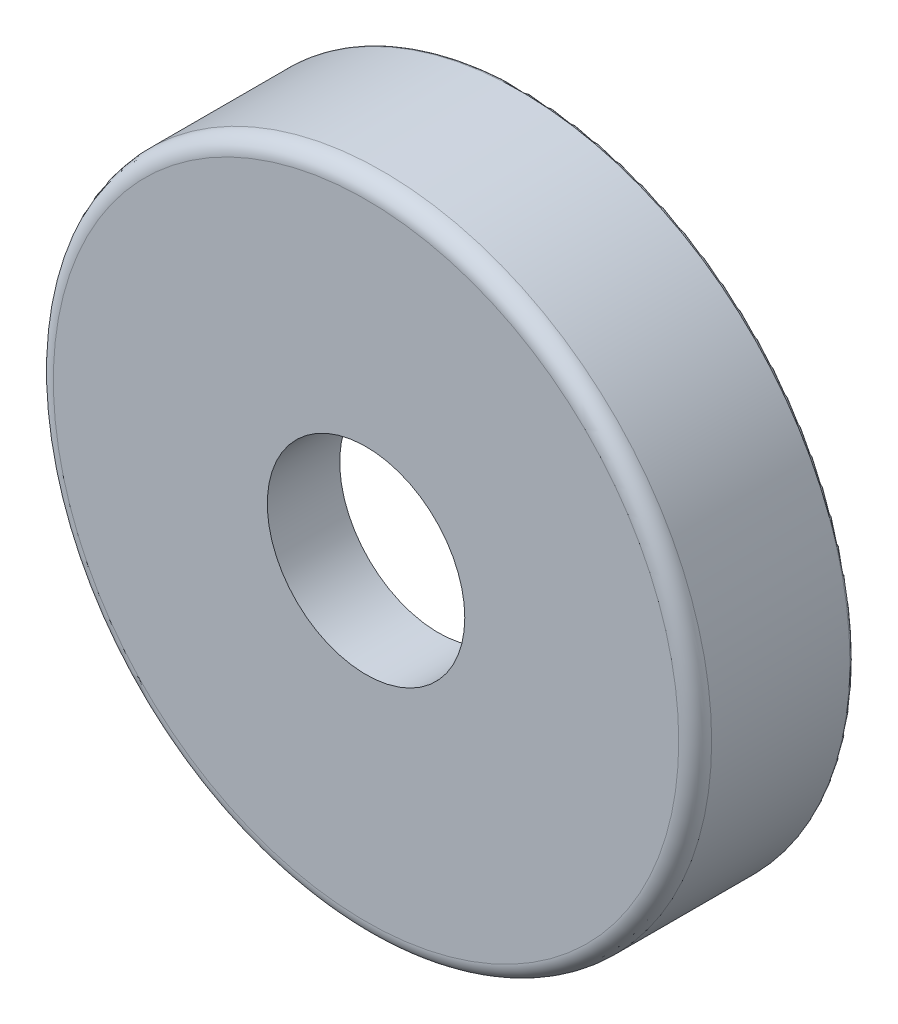
ISO-10303-21;
HEADER;
FILE_DESCRIPTION(('STEP AP214'),'2;1');
FILE_NAME('part.step','',(''),(''),'','','');
FILE_SCHEMA(('AUTOMOTIVE_DESIGN { 1 0 10303 214 1 1 1 1 }'));
ENDSEC;
DATA;
#1=APPLICATION_CONTEXT('core data for automotive mechanical design processes');
#2=APPLICATION_PROTOCOL_DEFINITION('international standard','automotive_design',2000,#1);
#3=PRODUCT_CONTEXT('',#1,'mechanical');
#4=PRODUCT('Part','Part','',(#3));
#5=PRODUCT_RELATED_PRODUCT_CATEGORY('part','',(#4));
#6=PRODUCT_DEFINITION_FORMATION('','',#4);
#7=PRODUCT_DEFINITION_CONTEXT('part definition',#1,'design');
#8=PRODUCT_DEFINITION('design','',#6,#7);
#9=PRODUCT_DEFINITION_SHAPE('','',#8);
#10=(LENGTH_UNIT() NAMED_UNIT(*) SI_UNIT(.MILLI.,.METRE.));
#11=(NAMED_UNIT(*) PLANE_ANGLE_UNIT() SI_UNIT($,.RADIAN.));
#12=(NAMED_UNIT(*) SI_UNIT($,.STERADIAN.) SOLID_ANGLE_UNIT());
#13=UNCERTAINTY_MEASURE_WITH_UNIT(LENGTH_MEASURE(1.E-05),#10,'distance_accuracy_value','');
#14=(GEOMETRIC_REPRESENTATION_CONTEXT(3) GLOBAL_UNCERTAINTY_ASSIGNED_CONTEXT((#13)) GLOBAL_UNIT_ASSIGNED_CONTEXT((#10,
#11,#12)) REPRESENTATION_CONTEXT('',''));
#15=CARTESIAN_POINT('',(0.,0.,0.));
#16=DIRECTION('',(0.,0.,1.));
#17=DIRECTION('',(1.,0.,0.));
#18=AXIS2_PLACEMENT_3D('',#15,#16,#17);
#19=CARTESIAN_POINT('',(0.,0.,4.8));
#20=DIRECTION('',(0.,0.,-1.));
#21=DIRECTION('',(-1.,0.,0.));
#22=AXIS2_PLACEMENT_3D('',#19,#20,#21);
#23=CYLINDRICAL_SURFACE('',#22,3.);
#24=CARTESIAN_POINT('',(0.,0.,4.8));
#25=DIRECTION('',(0.,0.,1.));
#26=DIRECTION('',(1.,0.,0.));
#27=AXIS2_PLACEMENT_3D('',#24,#25,#26);
#28=CIRCLE('',#27,3.);
#29=CARTESIAN_POINT('',(3.,0.,4.8));
#30=VERTEX_POINT('',#29);
#31=EDGE_CURVE('E67',#30,#30,#28,.T.);
#32=ORIENTED_EDGE('',*,*,#31,.T.);
#33=EDGE_LOOP('',(#32));
#34=FACE_BOUND('',#33,.T.);
#35=CARTESIAN_POINT('',(0.,0.,2.6));
#36=DIRECTION('',(0.,0.,1.));
#37=DIRECTION('',(1.,0.,0.));
#38=AXIS2_PLACEMENT_3D('',#35,#36,#37);
#39=CIRCLE('',#38,3.);
#40=CARTESIAN_POINT('',(3.,0.,2.6));
#41=VERTEX_POINT('',#40);
#42=EDGE_CURVE('E95',#41,#41,#39,.T.);
#43=ORIENTED_EDGE('',*,*,#42,.F.);
#44=EDGE_LOOP('',(#43));
#45=FACE_BOUND('',#44,.T.);
#46=ADVANCED_FACE('F43',(#34,#45),#23,.F.);
#47=CARTESIAN_POINT('',(0.,0.,4.8));
#48=DIRECTION('',(0.,0.,1.));
#49=DIRECTION('',(1.,0.,0.));
#50=AXIS2_PLACEMENT_3D('',#47,#48,#49);
#51=PLANE('',#50);
#52=CARTESIAN_POINT('',(0.,0.,4.8));
#53=DIRECTION('',(0.,0.,1.));
#54=DIRECTION('',(1.,0.,0.));
#55=AXIS2_PLACEMENT_3D('',#52,#53,#54);
#56=CIRCLE('',#55,9.5);
#57=CARTESIAN_POINT('',(9.5,0.,4.8));
#58=VERTEX_POINT('',#57);
#59=EDGE_CURVE('E61',#58,#58,#56,.T.);
#60=ORIENTED_EDGE('',*,*,#59,.T.);
#61=EDGE_LOOP('',(#60));
#62=FACE_BOUND('',#61,.T.);
#63=ORIENTED_EDGE('',*,*,#31,.F.);
#64=EDGE_LOOP('',(#63));
#65=FACE_BOUND('',#64,.T.);
#66=ADVANCED_FACE('F104',(#62,#65),#51,.T.);
#67=CARTESIAN_POINT('',(0.,0.,0.));
#68=DIRECTION('',(0.,0.,1.));
#69=DIRECTION('',(1.,0.,0.));
#70=AXIS2_PLACEMENT_3D('',#67,#68,#69);
#71=PLANE('',#70);
#72=CARTESIAN_POINT('',(0.,0.,0.));
#73=DIRECTION('',(0.,0.,1.));
#74=DIRECTION('',(1.,0.,0.));
#75=AXIS2_PLACEMENT_3D('',#72,#73,#74);
#76=CIRCLE('',#75,9.9);
#77=CARTESIAN_POINT('',(9.9,0.,0.));
#78=VERTEX_POINT('',#77);
#79=EDGE_CURVE('E10',#78,#78,#76,.F.);
#80=ORIENTED_EDGE('',*,*,#79,.T.);
#81=EDGE_LOOP('',(#80));
#82=FACE_BOUND('',#81,.T.);
#83=CARTESIAN_POINT('',(0.,0.,0.));
#84=DIRECTION('',(0.,0.,1.));
#85=DIRECTION('',(1.,0.,0.));
#86=AXIS2_PLACEMENT_3D('',#83,#84,#85);
#87=CIRCLE('',#86,9.50000000000001);
#88=CARTESIAN_POINT('',(9.50000000000001,0.,0.));
#89=VERTEX_POINT('',#88);
#90=EDGE_CURVE('E71',#89,#89,#87,.T.);
#91=ORIENTED_EDGE('',*,*,#90,.T.);
#92=EDGE_LOOP('',(#91));
#93=FACE_BOUND('',#92,.T.);
#94=ADVANCED_FACE('F110',(#82,#93),#71,.F.);
#95=CARTESIAN_POINT('',(0.,0.,4.8));
#96=DIRECTION('',(0.,0.,-1.));
#97=DIRECTION('',(-1.,0.,0.));
#98=AXIS2_PLACEMENT_3D('',#95,#96,#97);
#99=CYLINDRICAL_SURFACE('',#98,10.);
#100=CARTESIAN_POINT('',(0.,0.,0.1));
#101=DIRECTION('',(0.,0.,1.));
#102=DIRECTION('',(1.,0.,0.));
#103=AXIS2_PLACEMENT_3D('',#100,#101,#102);
#104=CIRCLE('',#103,10.);
#105=CARTESIAN_POINT('',(10.,0.,0.1));
#106=VERTEX_POINT('',#105);
#107=EDGE_CURVE('E51',#106,#106,#104,.T.);
#108=ORIENTED_EDGE('',*,*,#107,.T.);
#109=EDGE_LOOP('',(#108));
#110=FACE_BOUND('',#109,.T.);
#111=CARTESIAN_POINT('',(0.,0.,4.3));
#112=DIRECTION('',(0.,0.,1.));
#113=DIRECTION('',(1.,0.,0.));
#114=AXIS2_PLACEMENT_3D('',#111,#112,#113);
#115=CIRCLE('',#114,10.);
#116=CARTESIAN_POINT('',(10.,0.,4.3));
#117=VERTEX_POINT('',#116);
#118=EDGE_CURVE('E56',#117,#117,#115,.F.);
#119=ORIENTED_EDGE('',*,*,#118,.T.);
#120=EDGE_LOOP('',(#119));
#121=FACE_BOUND('',#120,.T.);
#122=ADVANCED_FACE('F119',(#110,#121),#99,.T.);
#123=CARTESIAN_POINT('',(0.,0.,1.));
#124=DIRECTION('',(0.,0.,1.));
#125=DIRECTION('',(1.,0.,0.));
#126=AXIS2_PLACEMENT_3D('',#123,#124,#125);
#127=TOROIDAL_SURFACE('',#126,9.5,1.);
#128=CARTESIAN_POINT('',(0.,0.,1.00000000000001));
#129=DIRECTION('',(0.,0.,1.));
#130=DIRECTION('',(1.,0.,0.));
#131=AXIS2_PLACEMENT_3D('',#128,#129,#130);
#132=CIRCLE('',#131,8.5);
#133=CARTESIAN_POINT('',(8.5,0.,1.00000000000001));
#134=VERTEX_POINT('',#133);
#135=EDGE_CURVE('E75',#134,#134,#132,.T.);
#136=ORIENTED_EDGE('',*,*,#135,.T.);
#137=EDGE_LOOP('',(#136));
#138=FACE_BOUND('',#137,.T.);
#139=ORIENTED_EDGE('',*,*,#90,.F.);
#140=EDGE_LOOP('',(#139));
#141=FACE_BOUND('',#140,.T.);
#142=ADVANCED_FACE('F114',(#138,#141),#127,.T.);
#143=CARTESIAN_POINT('',(0.,0.,0.));
#144=DIRECTION('',(0.,0.,1.));
#145=DIRECTION('',(1.,0.,0.));
#146=AXIS2_PLACEMENT_3D('',#143,#144,#145);
#147=CYLINDRICAL_SURFACE('',#146,8.5);
#148=CARTESIAN_POINT('',(0.,0.,1.79999999999999));
#149=DIRECTION('',(0.,0.,1.));
#150=DIRECTION('',(1.,0.,0.));
#151=AXIS2_PLACEMENT_3D('',#148,#149,#150);
#152=CIRCLE('',#151,8.5);
#153=CARTESIAN_POINT('',(8.5,0.,1.79999999999999));
#154=VERTEX_POINT('',#153);
#155=EDGE_CURVE('E79',#154,#154,#152,.T.);
#156=ORIENTED_EDGE('',*,*,#155,.T.);
#157=EDGE_LOOP('',(#156));
#158=FACE_BOUND('',#157,.T.);
#159=ORIENTED_EDGE('',*,*,#135,.F.);
#160=EDGE_LOOP('',(#159));
#161=FACE_BOUND('',#160,.T.);
#162=ADVANCED_FACE('F149',(#158,#161),#147,.F.);
#163=CARTESIAN_POINT('',(0.,0.,1.8));
#164=DIRECTION('',(0.,0.,1.));
#165=DIRECTION('',(1.,0.,0.));
#166=AXIS2_PLACEMENT_3D('',#163,#164,#165);
#167=TOROIDAL_SURFACE('',#166,7.5,1.);
#168=CARTESIAN_POINT('',(0.,0.,2.8));
#169=DIRECTION('',(0.,0.,1.));
#170=DIRECTION('',(1.,0.,0.));
#171=AXIS2_PLACEMENT_3D('',#168,#169,#170);
#172=CIRCLE('',#171,7.49999999999999);
#173=CARTESIAN_POINT('',(7.49999999999999,0.,2.8));
#174=VERTEX_POINT('',#173);
#175=EDGE_CURVE('E83',#174,#174,#172,.T.);
#176=ORIENTED_EDGE('',*,*,#175,.T.);
#177=EDGE_LOOP('',(#176));
#178=FACE_BOUND('',#177,.T.);
#179=ORIENTED_EDGE('',*,*,#155,.F.);
#180=EDGE_LOOP('',(#179));
#181=FACE_BOUND('',#180,.T.);
#182=ADVANCED_FACE('F146',(#178,#181),#167,.F.);
#183=CARTESIAN_POINT('',(-7.49999999999999,0.,2.8));
#184=DIRECTION('',(0.,0.,-1.));
#185=DIRECTION('',(-1.,0.,0.));
#186=AXIS2_PLACEMENT_3D('',#183,#184,#185);
#187=PLANE('',#186);
#188=CARTESIAN_POINT('',(0.,0.,2.8));
#189=DIRECTION('',(0.,0.,1.));
#190=DIRECTION('',(1.,0.,0.));
#191=AXIS2_PLACEMENT_3D('',#188,#189,#190);
#192=CIRCLE('',#191,4.);
#193=CARTESIAN_POINT('',(4.,0.,2.8));
#194=VERTEX_POINT('',#193);
#195=EDGE_CURVE('E87',#194,#194,#192,.T.);
#196=ORIENTED_EDGE('',*,*,#195,.T.);
#197=EDGE_LOOP('',(#196));
#198=FACE_BOUND('',#197,.T.);
#199=ORIENTED_EDGE('',*,*,#175,.F.);
#200=EDGE_LOOP('',(#199));
#201=FACE_BOUND('',#200,.T.);
#202=ADVANCED_FACE('F140',(#198,#201),#187,.T.);
#203=CARTESIAN_POINT('',(0.,0.,0.));
#204=DIRECTION('',(0.,0.,1.));
#205=DIRECTION('',(1.,0.,0.));
#206=AXIS2_PLACEMENT_3D('',#203,#204,#205);
#207=CYLINDRICAL_SURFACE('',#206,4.);
#208=CARTESIAN_POINT('',(0.,0.,2.6));
#209=DIRECTION('',(0.,0.,1.));
#210=DIRECTION('',(1.,0.,0.));
#211=AXIS2_PLACEMENT_3D('',#208,#209,#210);
#212=CIRCLE('',#211,4.);
#213=CARTESIAN_POINT('',(4.,0.,2.6));
#214=VERTEX_POINT('',#213);
#215=EDGE_CURVE('E91',#214,#214,#212,.T.);
#216=ORIENTED_EDGE('',*,*,#215,.T.);
#217=EDGE_LOOP('',(#216));
#218=FACE_BOUND('',#217,.T.);
#219=ORIENTED_EDGE('',*,*,#195,.F.);
#220=EDGE_LOOP('',(#219));
#221=FACE_BOUND('',#220,.T.);
#222=ADVANCED_FACE('F129',(#218,#221),#207,.T.);
#223=CARTESIAN_POINT('',(-4.,0.,2.6));
#224=DIRECTION('',(0.,0.,-1.));
#225=DIRECTION('',(-1.,0.,0.));
#226=AXIS2_PLACEMENT_3D('',#223,#224,#225);
#227=PLANE('',#226);
#228=ORIENTED_EDGE('',*,*,#42,.T.);
#229=EDGE_LOOP('',(#228));
#230=FACE_BOUND('',#229,.T.);
#231=ORIENTED_EDGE('',*,*,#215,.F.);
#232=EDGE_LOOP('',(#231));
#233=FACE_BOUND('',#232,.T.);
#234=ADVANCED_FACE('F100',(#230,#233),#227,.T.);
#235=CARTESIAN_POINT('',(0.,0.,4.3));
#236=DIRECTION('',(0.,0.,1.));
#237=DIRECTION('',(1.,0.,0.));
#238=AXIS2_PLACEMENT_3D('',#235,#236,#237);
#239=TOROIDAL_SURFACE('',#238,9.5,0.5);
#240=ORIENTED_EDGE('',*,*,#118,.F.);
#241=EDGE_LOOP('',(#240));
#242=FACE_BOUND('',#241,.T.);
#243=ORIENTED_EDGE('',*,*,#59,.F.);
#244=EDGE_LOOP('',(#243));
#245=FACE_BOUND('',#244,.T.);
#246=ADVANCED_FACE('F121',(#242,#245),#239,.T.);
#247=CARTESIAN_POINT('',(0.,0.,0.1));
#248=DIRECTION('',(0.,0.,1.));
#249=DIRECTION('',(1.,0.,0.));
#250=AXIS2_PLACEMENT_3D('',#247,#248,#249);
#251=TOROIDAL_SURFACE('',#250,9.9,0.1);
#252=ORIENTED_EDGE('',*,*,#79,.F.);
#253=EDGE_LOOP('',(#252));
#254=FACE_BOUND('',#253,.T.);
#255=ORIENTED_EDGE('',*,*,#107,.F.);
#256=EDGE_LOOP('',(#255));
#257=FACE_BOUND('',#256,.T.);
#258=ADVANCED_FACE('F45',(#254,#257),#251,.T.);
#259=CLOSED_SHELL('',(#46,#66,#94,#122,#142,#162,#182,#202,#222,#234,#246,#258));
#260=MANIFOLD_SOLID_BREP('B2',#259);
#261=ADVANCED_BREP_SHAPE_REPRESENTATION('',(#18,#260),#14);
#262=SHAPE_DEFINITION_REPRESENTATION(#9,#261);
ENDSEC;
END-ISO-10303-21;
